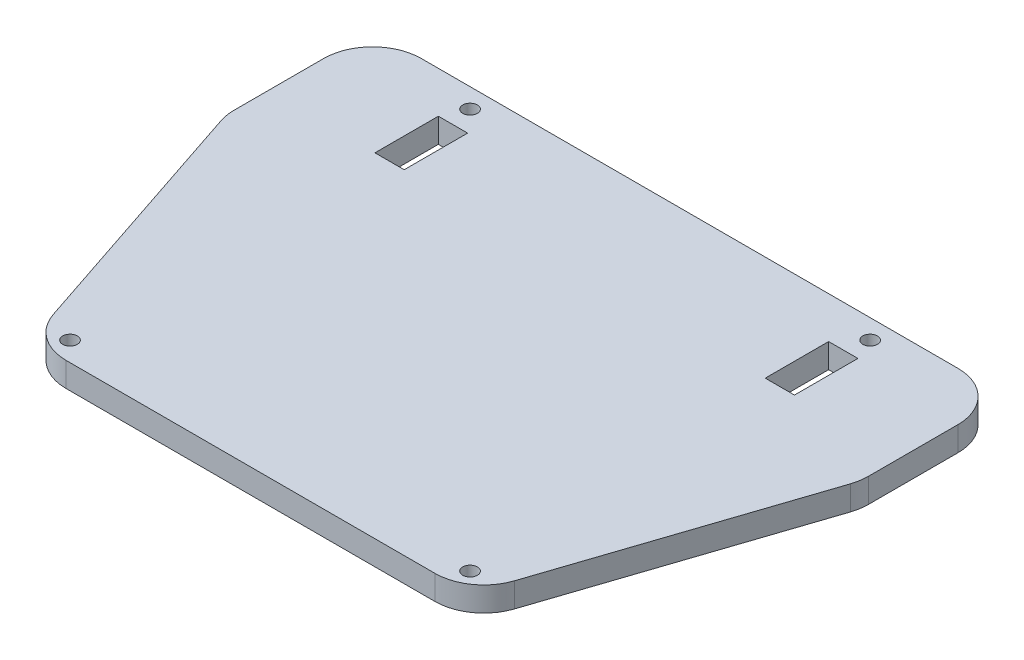
ISO-10303-21;
HEADER;
FILE_DESCRIPTION(('STEP AP214'),'2;1');
FILE_NAME('part.step','',(''),(''),'','','');
FILE_SCHEMA(('AUTOMOTIVE_DESIGN { 1 0 10303 214 1 1 1 1 }'));
ENDSEC;
DATA;
#1=APPLICATION_CONTEXT('core data for automotive mechanical design processes');
#2=APPLICATION_PROTOCOL_DEFINITION('international standard','automotive_design',2000,#1);
#3=PRODUCT_CONTEXT('',#1,'mechanical');
#4=PRODUCT('Part','Part','',(#3));
#5=PRODUCT_RELATED_PRODUCT_CATEGORY('part','',(#4));
#6=PRODUCT_DEFINITION_FORMATION('','',#4);
#7=PRODUCT_DEFINITION_CONTEXT('part definition',#1,'design');
#8=PRODUCT_DEFINITION('design','',#6,#7);
#9=PRODUCT_DEFINITION_SHAPE('','',#8);
#10=(LENGTH_UNIT() NAMED_UNIT(*) SI_UNIT(.MILLI.,.METRE.));
#11=(NAMED_UNIT(*) PLANE_ANGLE_UNIT() SI_UNIT($,.RADIAN.));
#12=(NAMED_UNIT(*) SI_UNIT($,.STERADIAN.) SOLID_ANGLE_UNIT());
#13=UNCERTAINTY_MEASURE_WITH_UNIT(LENGTH_MEASURE(1.E-05),#10,'distance_accuracy_value','');
#14=(GEOMETRIC_REPRESENTATION_CONTEXT(3) GLOBAL_UNCERTAINTY_ASSIGNED_CONTEXT((#13)) GLOBAL_UNIT_ASSIGNED_CONTEXT((#10,
#11,#12)) REPRESENTATION_CONTEXT('',''));
#15=CARTESIAN_POINT('',(0.,0.,0.));
#16=DIRECTION('',(0.,0.,1.));
#17=DIRECTION('',(1.,0.,0.));
#18=AXIS2_PLACEMENT_3D('',#15,#16,#17);
#19=CARTESIAN_POINT('',(8.,5.,0.));
#20=DIRECTION('',(-1.,0.,0.));
#21=DIRECTION('',(0.,0.,1.));
#22=AXIS2_PLACEMENT_3D('',#19,#20,#21);
#23=PLANE('',#22);
#24=DIRECTION('',(0.,0.,-1.));
#25=VECTOR('',#24,1.);
#26=CARTESIAN_POINT('',(8.,0.,0.));
#27=LINE('',#26,#25);
#28=CARTESIAN_POINT('',(8.,0.,-68.5));
#29=VERTEX_POINT('',#28);
#30=CARTESIAN_POINT('',(8.,0.,-81.5));
#31=VERTEX_POINT('',#30);
#32=EDGE_CURVE('E311',#29,#31,#27,.T.);
#33=ORIENTED_EDGE('',*,*,#32,.F.);
#34=DIRECTION('',(0.,-1.,0.));
#35=VECTOR('',#34,1.);
#36=CARTESIAN_POINT('',(8.,5.,-68.5));
#37=LINE('',#36,#35);
#38=CARTESIAN_POINT('',(8.,5.,-68.5));
#39=VERTEX_POINT('',#38);
#40=EDGE_CURVE('E345',#39,#29,#37,.T.);
#41=ORIENTED_EDGE('',*,*,#40,.F.);
#42=DIRECTION('',(0.,0.,-1.));
#43=VECTOR('',#42,1.);
#44=CARTESIAN_POINT('',(8.,5.,0.));
#45=LINE('',#44,#43);
#46=CARTESIAN_POINT('',(8.,5.,-81.5));
#47=VERTEX_POINT('',#46);
#48=EDGE_CURVE('E238',#39,#47,#45,.T.);
#49=ORIENTED_EDGE('',*,*,#48,.T.);
#50=DIRECTION('',(0.,-1.,0.));
#51=VECTOR('',#50,1.);
#52=CARTESIAN_POINT('',(8.,5.,-81.5));
#53=LINE('',#52,#51);
#54=EDGE_CURVE('E197',#47,#31,#53,.T.);
#55=ORIENTED_EDGE('',*,*,#54,.T.);
#56=EDGE_LOOP('',(#33,#41,#49,#55));
#57=FACE_BOUND('',#56,.T.);
#58=ADVANCED_FACE('F46',(#57),#23,.T.);
#59=CARTESIAN_POINT('',(0.,5.,-68.5));
#60=DIRECTION('',(0.,0.,-1.));
#61=DIRECTION('',(-1.,0.,0.));
#62=AXIS2_PLACEMENT_3D('',#59,#60,#61);
#63=PLANE('',#62);
#64=DIRECTION('',(1.,0.,0.));
#65=VECTOR('',#64,1.);
#66=CARTESIAN_POINT('',(0.,0.,-68.5));
#67=LINE('',#66,#65);
#68=CARTESIAN_POINT('',(2.,0.,-68.5));
#69=VERTEX_POINT('',#68);
#70=EDGE_CURVE('E315',#69,#29,#67,.T.);
#71=ORIENTED_EDGE('',*,*,#70,.F.);
#72=DIRECTION('',(0.,-1.,0.));
#73=VECTOR('',#72,1.);
#74=CARTESIAN_POINT('',(2.,5.,-68.5));
#75=LINE('',#74,#73);
#76=CARTESIAN_POINT('',(2.,5.,-68.5));
#77=VERTEX_POINT('',#76);
#78=EDGE_CURVE('E342',#77,#69,#75,.T.);
#79=ORIENTED_EDGE('',*,*,#78,.F.);
#80=DIRECTION('',(1.,0.,0.));
#81=VECTOR('',#80,1.);
#82=CARTESIAN_POINT('',(0.,5.,-68.5));
#83=LINE('',#82,#81);
#84=EDGE_CURVE('E243',#77,#39,#83,.T.);
#85=ORIENTED_EDGE('',*,*,#84,.T.);
#86=ORIENTED_EDGE('',*,*,#40,.T.);
#87=EDGE_LOOP('',(#71,#79,#85,#86));
#88=FACE_BOUND('',#87,.T.);
#89=ADVANCED_FACE('F511',(#88),#63,.T.);
#90=CARTESIAN_POINT('',(2.,5.,0.));
#91=DIRECTION('',(-1.,0.,0.));
#92=DIRECTION('',(0.,0.,1.));
#93=AXIS2_PLACEMENT_3D('',#90,#91,#92);
#94=PLANE('',#93);
#95=DIRECTION('',(0.,0.,-1.));
#96=VECTOR('',#95,1.);
#97=CARTESIAN_POINT('',(2.,0.,0.));
#98=LINE('',#97,#96);
#99=CARTESIAN_POINT('',(2.,0.,-81.5));
#100=VERTEX_POINT('',#99);
#101=EDGE_CURVE('E319',#69,#100,#98,.T.);
#102=ORIENTED_EDGE('',*,*,#101,.T.);
#103=DIRECTION('',(0.,-1.,0.));
#104=VECTOR('',#103,1.);
#105=CARTESIAN_POINT('',(2.,5.,-81.5));
#106=LINE('',#105,#104);
#107=CARTESIAN_POINT('',(2.,5.,-81.5));
#108=VERTEX_POINT('',#107);
#109=EDGE_CURVE('E338',#108,#100,#106,.T.);
#110=ORIENTED_EDGE('',*,*,#109,.F.);
#111=DIRECTION('',(0.,0.,-1.));
#112=VECTOR('',#111,1.);
#113=CARTESIAN_POINT('',(2.,5.,0.));
#114=LINE('',#113,#112);
#115=EDGE_CURVE('E249',#77,#108,#114,.T.);
#116=ORIENTED_EDGE('',*,*,#115,.F.);
#117=ORIENTED_EDGE('',*,*,#78,.T.);
#118=EDGE_LOOP('',(#102,#110,#116,#117));
#119=FACE_BOUND('',#118,.T.);
#120=ADVANCED_FACE('F523',(#119),#94,.F.);
#121=CARTESIAN_POINT('',(88.,5.,0.));
#122=DIRECTION('',(-1.,0.,0.));
#123=DIRECTION('',(0.,0.,1.));
#124=AXIS2_PLACEMENT_3D('',#121,#122,#123);
#125=PLANE('',#124);
#126=DIRECTION('',(0.,0.,-1.));
#127=VECTOR('',#126,1.);
#128=CARTESIAN_POINT('',(88.,0.,0.));
#129=LINE('',#128,#127);
#130=CARTESIAN_POINT('',(88.,0.,-68.5));
#131=VERTEX_POINT('',#130);
#132=CARTESIAN_POINT('',(88.,0.,-81.5));
#133=VERTEX_POINT('',#132);
#134=EDGE_CURVE('E192',#131,#133,#129,.T.);
#135=ORIENTED_EDGE('',*,*,#134,.F.);
#136=DIRECTION('',(0.,-1.,0.));
#137=VECTOR('',#136,1.);
#138=CARTESIAN_POINT('',(88.,5.,-68.5));
#139=LINE('',#138,#137);
#140=CARTESIAN_POINT('',(88.,5.,-68.5));
#141=VERTEX_POINT('',#140);
#142=EDGE_CURVE('E185',#141,#131,#139,.T.);
#143=ORIENTED_EDGE('',*,*,#142,.F.);
#144=DIRECTION('',(0.,0.,-1.));
#145=VECTOR('',#144,1.);
#146=CARTESIAN_POINT('',(88.,5.,0.));
#147=LINE('',#146,#145);
#148=CARTESIAN_POINT('',(88.,5.,-81.5));
#149=VERTEX_POINT('',#148);
#150=EDGE_CURVE('E189',#141,#149,#147,.T.);
#151=ORIENTED_EDGE('',*,*,#150,.T.);
#152=DIRECTION('',(0.,-1.,0.));
#153=VECTOR('',#152,1.);
#154=CARTESIAN_POINT('',(88.,5.,-81.5));
#155=LINE('',#154,#153);
#156=EDGE_CURVE('E265',#149,#133,#155,.T.);
#157=ORIENTED_EDGE('',*,*,#156,.T.);
#158=EDGE_LOOP('',(#135,#143,#151,#157));
#159=FACE_BOUND('',#158,.T.);
#160=ADVANCED_FACE('F187',(#159),#125,.T.);
#161=CARTESIAN_POINT('',(0.,5.,-68.5));
#162=DIRECTION('',(0.,0.,1.));
#163=DIRECTION('',(1.,0.,0.));
#164=AXIS2_PLACEMENT_3D('',#161,#162,#163);
#165=PLANE('',#164);
#166=DIRECTION('',(-1.,0.,0.));
#167=VECTOR('',#166,1.);
#168=CARTESIAN_POINT('',(0.,0.,-68.5));
#169=LINE('',#168,#167);
#170=CARTESIAN_POINT('',(82.,0.,-68.5));
#171=VERTEX_POINT('',#170);
#172=EDGE_CURVE('E300',#131,#171,#169,.T.);
#173=ORIENTED_EDGE('',*,*,#172,.T.);
#174=DIRECTION('',(0.,-1.,0.));
#175=VECTOR('',#174,1.);
#176=CARTESIAN_POINT('',(82.,5.,-68.5));
#177=LINE('',#176,#175);
#178=CARTESIAN_POINT('',(82.,5.,-68.5));
#179=VERTEX_POINT('',#178);
#180=EDGE_CURVE('E198',#179,#171,#177,.T.);
#181=ORIENTED_EDGE('',*,*,#180,.F.);
#182=DIRECTION('',(-1.,0.,0.));
#183=VECTOR('',#182,1.);
#184=CARTESIAN_POINT('',(0.,5.,-68.5));
#185=LINE('',#184,#183);
#186=EDGE_CURVE('E202',#141,#179,#185,.T.);
#187=ORIENTED_EDGE('',*,*,#186,.F.);
#188=ORIENTED_EDGE('',*,*,#142,.T.);
#189=EDGE_LOOP('',(#173,#181,#187,#188));
#190=FACE_BOUND('',#189,.T.);
#191=ADVANCED_FACE('F203',(#190),#165,.F.);
#192=CARTESIAN_POINT('',(82.,5.,0.));
#193=DIRECTION('',(-1.,0.,0.));
#194=DIRECTION('',(0.,0.,1.));
#195=AXIS2_PLACEMENT_3D('',#192,#193,#194);
#196=PLANE('',#195);
#197=DIRECTION('',(0.,0.,-1.));
#198=VECTOR('',#197,1.);
#199=CARTESIAN_POINT('',(82.,0.,0.));
#200=LINE('',#199,#198);
#201=CARTESIAN_POINT('',(82.,0.,-81.5));
#202=VERTEX_POINT('',#201);
#203=EDGE_CURVE('E303',#171,#202,#200,.T.);
#204=ORIENTED_EDGE('',*,*,#203,.T.);
#205=DIRECTION('',(0.,-1.,0.));
#206=VECTOR('',#205,1.);
#207=CARTESIAN_POINT('',(82.,5.,-81.5));
#208=LINE('',#207,#206);
#209=CARTESIAN_POINT('',(82.,5.,-81.5));
#210=VERTEX_POINT('',#209);
#211=EDGE_CURVE('E351',#210,#202,#208,.T.);
#212=ORIENTED_EDGE('',*,*,#211,.F.);
#213=DIRECTION('',(0.,0.,-1.));
#214=VECTOR('',#213,1.);
#215=CARTESIAN_POINT('',(82.,5.,0.));
#216=LINE('',#215,#214);
#217=EDGE_CURVE('E207',#179,#210,#216,.T.);
#218=ORIENTED_EDGE('',*,*,#217,.F.);
#219=ORIENTED_EDGE('',*,*,#180,.T.);
#220=EDGE_LOOP('',(#204,#212,#218,#219));
#221=FACE_BOUND('',#220,.T.);
#222=ADVANCED_FACE('F548',(#221),#196,.F.);
#223=CARTESIAN_POINT('',(-20.,5.,0.));
#224=DIRECTION('',(1.,0.,0.));
#225=DIRECTION('',(0.,0.,-1.));
#226=AXIS2_PLACEMENT_3D('',#223,#224,#225);
#227=PLANE('',#226);
#228=DIRECTION('',(0.,0.,1.));
#229=VECTOR('',#228,1.);
#230=CARTESIAN_POINT('',(-20.,0.,0.));
#231=LINE('',#230,#229);
#232=CARTESIAN_POINT('',(-20.,0.,-80.));
#233=VERTEX_POINT('',#232);
#234=CARTESIAN_POINT('',(-20.,0.,-61.6227766016838));
#235=VERTEX_POINT('',#234);
#236=EDGE_CURVE('E266',#233,#235,#231,.T.);
#237=ORIENTED_EDGE('',*,*,#236,.T.);
#238=DIRECTION('',(0.,-1.,0.));
#239=VECTOR('',#238,1.);
#240=CARTESIAN_POINT('',(-20.,5.,-61.6227766016838));
#241=LINE('',#240,#239);
#242=CARTESIAN_POINT('',(-20.,5.,-61.6227766016838));
#243=VERTEX_POINT('',#242);
#244=EDGE_CURVE('E12',#235,#243,#241,.F.);
#245=ORIENTED_EDGE('',*,*,#244,.T.);
#246=DIRECTION('',(0.,0.,1.));
#247=VECTOR('',#246,1.);
#248=CARTESIAN_POINT('',(-20.,5.,0.));
#249=LINE('',#248,#247);
#250=CARTESIAN_POINT('',(-20.,5.,-80.));
#251=VERTEX_POINT('',#250);
#252=EDGE_CURVE('E335',#251,#243,#249,.T.);
#253=ORIENTED_EDGE('',*,*,#252,.F.);
#254=DIRECTION('',(0.,-1.,0.));
#255=VECTOR('',#254,1.);
#256=CARTESIAN_POINT('',(-20.,5.,-80.));
#257=LINE('',#256,#255);
#258=EDGE_CURVE('E55',#251,#233,#257,.T.);
#259=ORIENTED_EDGE('',*,*,#258,.T.);
#260=EDGE_LOOP('',(#237,#245,#253,#259));
#261=FACE_BOUND('',#260,.T.);
#262=ADVANCED_FACE('F468',(#261),#227,.F.);
#263=CARTESIAN_POINT('',(0.,5.,0.));
#264=DIRECTION('',(0.948683298050514,0.,-0.316227766016838));
#265=DIRECTION('',(-0.316227766016838,0.,-0.948683298050514));
#266=AXIS2_PLACEMENT_3D('',#263,#264,#265);
#267=PLANE('',#266);
#268=DIRECTION('',(0.316227766016838,0.,0.948683298050514));
#269=VECTOR('',#268,1.);
#270=CARTESIAN_POINT('',(0.,0.,0.));
#271=LINE('',#270,#269);
#272=CARTESIAN_POINT('',(-19.4868329805051,0.,-58.4604989415154));
#273=VERTEX_POINT('',#272);
#274=CARTESIAN_POINT('',(-2.27924077994387,0.,-6.83772233983162));
#275=VERTEX_POINT('',#274);
#276=EDGE_CURVE('E270',#273,#275,#271,.T.);
#277=ORIENTED_EDGE('',*,*,#276,.T.);
#278=DIRECTION('',(0.,-1.,0.));
#279=VECTOR('',#278,1.);
#280=CARTESIAN_POINT('',(-2.27924077994387,5.,-6.83772233983162));
#281=LINE('',#280,#279);
#282=CARTESIAN_POINT('',(-2.27924077994387,5.,-6.83772233983162));
#283=VERTEX_POINT('',#282);
#284=EDGE_CURVE('E460',#275,#283,#281,.F.);
#285=ORIENTED_EDGE('',*,*,#284,.T.);
#286=DIRECTION('',(0.316227766016838,0.,0.948683298050514));
#287=VECTOR('',#286,1.);
#288=CARTESIAN_POINT('',(0.,5.,0.));
#289=LINE('',#288,#287);
#290=CARTESIAN_POINT('',(-19.4868329805051,5.,-58.4604989415154));
#291=VERTEX_POINT('',#290);
#292=EDGE_CURVE('E406',#291,#283,#289,.T.);
#293=ORIENTED_EDGE('',*,*,#292,.F.);
#294=DIRECTION('',(0.,-1.,0.));
#295=VECTOR('',#294,1.);
#296=CARTESIAN_POINT('',(-19.4868329805051,5.,-58.4604989415154));
#297=LINE('',#296,#295);
#298=EDGE_CURVE('E456',#291,#273,#297,.T.);
#299=ORIENTED_EDGE('',*,*,#298,.T.);
#300=EDGE_LOOP('',(#277,#285,#293,#299));
#301=FACE_BOUND('',#300,.T.);
#302=ADVANCED_FACE('F483',(#301),#267,.F.);
#303=CARTESIAN_POINT('',(0.,5.,0.));
#304=DIRECTION('',(0.,0.,-1.));
#305=DIRECTION('',(-1.,0.,0.));
#306=AXIS2_PLACEMENT_3D('',#303,#304,#305);
#307=PLANE('',#306);
#308=DIRECTION('',(1.,0.,0.));
#309=VECTOR('',#308,1.);
#310=CARTESIAN_POINT('',(0.,0.,0.));
#311=LINE('',#310,#309);
#312=CARTESIAN_POINT('',(7.20759220056126,0.,0.));
#313=VERTEX_POINT('',#312);
#314=CARTESIAN_POINT('',(82.7924077994387,0.,0.));
#315=VERTEX_POINT('',#314);
#316=EDGE_CURVE('E274',#313,#315,#311,.T.);
#317=ORIENTED_EDGE('',*,*,#316,.T.);
#318=DIRECTION('',(0.,-1.,0.));
#319=VECTOR('',#318,1.);
#320=CARTESIAN_POINT('',(82.7924077994387,5.,0.));
#321=LINE('',#320,#319);
#322=CARTESIAN_POINT('',(82.7924077994387,5.,0.));
#323=VERTEX_POINT('',#322);
#324=EDGE_CURVE('E453',#315,#323,#321,.F.);
#325=ORIENTED_EDGE('',*,*,#324,.T.);
#326=DIRECTION('',(1.,0.,0.));
#327=VECTOR('',#326,1.);
#328=CARTESIAN_POINT('',(0.,5.,0.));
#329=LINE('',#328,#327);
#330=CARTESIAN_POINT('',(7.20759220056126,5.,0.));
#331=VERTEX_POINT('',#330);
#332=EDGE_CURVE('E411',#331,#323,#329,.T.);
#333=ORIENTED_EDGE('',*,*,#332,.F.);
#334=DIRECTION('',(0.,-1.,0.));
#335=VECTOR('',#334,1.);
#336=CARTESIAN_POINT('',(7.20759220056126,5.,0.));
#337=LINE('',#336,#335);
#338=EDGE_CURVE('E449',#331,#313,#337,.T.);
#339=ORIENTED_EDGE('',*,*,#338,.T.);
#340=EDGE_LOOP('',(#317,#325,#333,#339));
#341=FACE_BOUND('',#340,.T.);
#342=ADVANCED_FACE('F494',(#341),#307,.F.);
#343=CARTESIAN_POINT('',(81.,5.,27.));
#344=DIRECTION('',(0.948683298050514,0.,0.316227766016837));
#345=DIRECTION('',(0.316227766016837,0.,-0.948683298050514));
#346=AXIS2_PLACEMENT_3D('',#343,#344,#345);
#347=PLANE('',#346);
#348=DIRECTION('',(-0.316227766016838,0.,0.948683298050514));
#349=VECTOR('',#348,1.);
#350=CARTESIAN_POINT('',(81.,0.,27.));
#351=LINE('',#350,#349);
#352=CARTESIAN_POINT('',(109.486832980505,0.,-58.4604989415155));
#353=VERTEX_POINT('',#352);
#354=CARTESIAN_POINT('',(92.2792407799439,0.,-6.83772233983163));
#355=VERTEX_POINT('',#354);
#356=EDGE_CURVE('E278',#353,#355,#351,.T.);
#357=ORIENTED_EDGE('',*,*,#356,.F.);
#358=DIRECTION('',(0.,-1.,0.));
#359=VECTOR('',#358,1.);
#360=CARTESIAN_POINT('',(109.486832980505,5.,-58.4604989415154));
#361=LINE('',#360,#359);
#362=CARTESIAN_POINT('',(109.486832980505,5.,-58.4604989415155));
#363=VERTEX_POINT('',#362);
#364=EDGE_CURVE('E69',#353,#363,#361,.F.);
#365=ORIENTED_EDGE('',*,*,#364,.T.);
#366=DIRECTION('',(-0.316227766016838,0.,0.948683298050514));
#367=VECTOR('',#366,1.);
#368=CARTESIAN_POINT('',(81.,5.,27.));
#369=LINE('',#368,#367);
#370=CARTESIAN_POINT('',(92.2792407799439,5.,-6.83772233983163));
#371=VERTEX_POINT('',#370);
#372=EDGE_CURVE('E428',#363,#371,#369,.T.);
#373=ORIENTED_EDGE('',*,*,#372,.T.);
#374=DIRECTION('',(0.,-1.,0.));
#375=VECTOR('',#374,1.);
#376=CARTESIAN_POINT('',(92.2792407799439,0.,-6.83772233983162));
#377=LINE('',#376,#375);
#378=EDGE_CURVE('E443',#371,#355,#377,.T.);
#379=ORIENTED_EDGE('',*,*,#378,.T.);
#380=EDGE_LOOP('',(#357,#365,#373,#379));
#381=FACE_BOUND('',#380,.T.);
#382=ADVANCED_FACE('F499',(#381),#347,.T.);
#383=CARTESIAN_POINT('',(110.,5.,0.));
#384=DIRECTION('',(1.,0.,0.));
#385=DIRECTION('',(0.,0.,-1.));
#386=AXIS2_PLACEMENT_3D('',#383,#384,#385);
#387=PLANE('',#386);
#388=DIRECTION('',(0.,0.,1.));
#389=VECTOR('',#388,1.);
#390=CARTESIAN_POINT('',(110.,0.,0.));
#391=LINE('',#390,#389);
#392=CARTESIAN_POINT('',(110.,0.,-80.));
#393=VERTEX_POINT('',#392);
#394=CARTESIAN_POINT('',(110.,0.,-61.6227766016838));
#395=VERTEX_POINT('',#394);
#396=EDGE_CURVE('E282',#393,#395,#391,.T.);
#397=ORIENTED_EDGE('',*,*,#396,.F.);
#398=DIRECTION('',(0.,-1.,0.));
#399=VECTOR('',#398,1.);
#400=CARTESIAN_POINT('',(110.,5.,-80.));
#401=LINE('',#400,#399);
#402=CARTESIAN_POINT('',(110.,5.,-80.));
#403=VERTEX_POINT('',#402);
#404=EDGE_CURVE('E384',#393,#403,#401,.F.);
#405=ORIENTED_EDGE('',*,*,#404,.T.);
#406=DIRECTION('',(0.,0.,1.));
#407=VECTOR('',#406,1.);
#408=CARTESIAN_POINT('',(110.,5.,0.));
#409=LINE('',#408,#407);
#410=CARTESIAN_POINT('',(110.,5.,-61.6227766016838));
#411=VERTEX_POINT('',#410);
#412=EDGE_CURVE('E432',#403,#411,#409,.T.);
#413=ORIENTED_EDGE('',*,*,#412,.T.);
#414=DIRECTION('',(0.,-1.,0.));
#415=VECTOR('',#414,1.);
#416=CARTESIAN_POINT('',(110.,5.,-61.6227766016838));
#417=LINE('',#416,#415);
#418=EDGE_CURVE('E380',#411,#395,#417,.T.);
#419=ORIENTED_EDGE('',*,*,#418,.T.);
#420=EDGE_LOOP('',(#397,#405,#413,#419));
#421=FACE_BOUND('',#420,.T.);
#422=ADVANCED_FACE('F537',(#421),#387,.T.);
#423=CARTESIAN_POINT('',(85.9999999999999,5.,-3.99999999999998));
#424=DIRECTION('',(0.,-1.,0.));
#425=DIRECTION('',(0.,0.,-1.));
#426=AXIS2_PLACEMENT_3D('',#423,#424,#425);
#427=CYLINDRICAL_SURFACE('',#426,1.5);
#428=CARTESIAN_POINT('',(85.9999999999999,5.,-3.99999999999998));
#429=DIRECTION('',(0.,1.,0.));
#430=DIRECTION('',(0.,0.,1.));
#431=AXIS2_PLACEMENT_3D('',#428,#429,#430);
#432=CIRCLE('',#431,1.5);
#433=CARTESIAN_POINT('',(85.9999999999999,5.,-2.49999999999998));
#434=VERTEX_POINT('',#433);
#435=EDGE_CURVE('E256',#434,#434,#432,.T.);
#436=ORIENTED_EDGE('',*,*,#435,.T.);
#437=EDGE_LOOP('',(#436));
#438=FACE_BOUND('',#437,.T.);
#439=CARTESIAN_POINT('',(85.9999999999999,0.,-3.99999999999998));
#440=DIRECTION('',(0.,1.,0.));
#441=DIRECTION('',(0.,0.,1.));
#442=AXIS2_PLACEMENT_3D('',#439,#440,#441);
#443=CIRCLE('',#442,1.5);
#444=CARTESIAN_POINT('',(85.9999999999999,0.,-2.49999999999998));
#445=VERTEX_POINT('',#444);
#446=EDGE_CURVE('E327',#445,#445,#443,.T.);
#447=ORIENTED_EDGE('',*,*,#446,.F.);
#448=EDGE_LOOP('',(#447));
#449=FACE_BOUND('',#448,.T.);
#450=ADVANCED_FACE('F528',(#438,#449),#427,.F.);
#451=CARTESIAN_POINT('',(0.,5.,-81.5));
#452=DIRECTION('',(0.,0.,-1.));
#453=DIRECTION('',(-1.,0.,0.));
#454=AXIS2_PLACEMENT_3D('',#451,#452,#453);
#455=PLANE('',#454);
#456=DIRECTION('',(1.,0.,0.));
#457=VECTOR('',#456,1.);
#458=CARTESIAN_POINT('',(0.,0.,-81.5));
#459=LINE('',#458,#457);
#460=EDGE_CURVE('E323',#100,#31,#459,.T.);
#461=ORIENTED_EDGE('',*,*,#460,.T.);
#462=ORIENTED_EDGE('',*,*,#54,.F.);
#463=DIRECTION('',(1.,0.,0.));
#464=VECTOR('',#463,1.);
#465=CARTESIAN_POINT('',(0.,5.,-81.5));
#466=LINE('',#465,#464);
#467=EDGE_CURVE('E253',#108,#47,#466,.T.);
#468=ORIENTED_EDGE('',*,*,#467,.F.);
#469=ORIENTED_EDGE('',*,*,#109,.T.);
#470=EDGE_LOOP('',(#461,#462,#468,#469));
#471=FACE_BOUND('',#470,.T.);
#472=ADVANCED_FACE('F525',(#471),#455,.F.);
#473=CARTESIAN_POINT('',(0.,5.,-81.5));
#474=DIRECTION('',(0.,0.,1.));
#475=DIRECTION('',(1.,0.,0.));
#476=AXIS2_PLACEMENT_3D('',#473,#474,#475);
#477=PLANE('',#476);
#478=DIRECTION('',(-1.,0.,0.));
#479=VECTOR('',#478,1.);
#480=CARTESIAN_POINT('',(0.,0.,-81.5));
#481=LINE('',#480,#479);
#482=EDGE_CURVE('E307',#133,#202,#481,.T.);
#483=ORIENTED_EDGE('',*,*,#482,.F.);
#484=ORIENTED_EDGE('',*,*,#156,.F.);
#485=DIRECTION('',(-1.,0.,0.));
#486=VECTOR('',#485,1.);
#487=CARTESIAN_POINT('',(0.,5.,-81.5));
#488=LINE('',#487,#486);
#489=EDGE_CURVE('E212',#149,#210,#488,.T.);
#490=ORIENTED_EDGE('',*,*,#489,.T.);
#491=ORIENTED_EDGE('',*,*,#211,.T.);
#492=EDGE_LOOP('',(#483,#484,#490,#491));
#493=FACE_BOUND('',#492,.T.);
#494=ADVANCED_FACE('F527',(#493),#477,.T.);
#495=CARTESIAN_POINT('',(4.,5.,-86.));
#496=DIRECTION('',(0.,-1.,0.));
#497=DIRECTION('',(0.,0.,-1.));
#498=AXIS2_PLACEMENT_3D('',#495,#496,#497);
#499=CYLINDRICAL_SURFACE('',#498,1.5);
#500=CARTESIAN_POINT('',(4.,5.,-86.));
#501=DIRECTION('',(0.,1.,0.));
#502=DIRECTION('',(0.,0.,1.));
#503=AXIS2_PLACEMENT_3D('',#500,#501,#502);
#504=CIRCLE('',#503,1.5);
#505=CARTESIAN_POINT('',(4.,5.,-84.5));
#506=VERTEX_POINT('',#505);
#507=EDGE_CURVE('E214',#506,#506,#504,.T.);
#508=ORIENTED_EDGE('',*,*,#507,.T.);
#509=EDGE_LOOP('',(#508));
#510=FACE_BOUND('',#509,.T.);
#511=CARTESIAN_POINT('',(4.,0.,-86.));
#512=DIRECTION('',(0.,1.,0.));
#513=DIRECTION('',(0.,0.,1.));
#514=AXIS2_PLACEMENT_3D('',#511,#512,#513);
#515=CIRCLE('',#514,1.5);
#516=CARTESIAN_POINT('',(4.,0.,-84.5));
#517=VERTEX_POINT('',#516);
#518=EDGE_CURVE('E294',#517,#517,#515,.T.);
#519=ORIENTED_EDGE('',*,*,#518,.F.);
#520=EDGE_LOOP('',(#519));
#521=FACE_BOUND('',#520,.T.);
#522=ADVANCED_FACE('F534',(#510,#521),#499,.F.);
#523=CARTESIAN_POINT('',(86.,5.,-86.));
#524=DIRECTION('',(0.,-1.,0.));
#525=DIRECTION('',(0.,0.,-1.));
#526=AXIS2_PLACEMENT_3D('',#523,#524,#525);
#527=CYLINDRICAL_SURFACE('',#526,1.5);
#528=CARTESIAN_POINT('',(86.,5.,-86.));
#529=DIRECTION('',(0.,1.,0.));
#530=DIRECTION('',(0.,0.,1.));
#531=AXIS2_PLACEMENT_3D('',#528,#529,#530);
#532=CIRCLE('',#531,1.5);
#533=CARTESIAN_POINT('',(86.,5.,-84.5));
#534=VERTEX_POINT('',#533);
#535=EDGE_CURVE('E218',#534,#534,#532,.F.);
#536=ORIENTED_EDGE('',*,*,#535,.F.);
#537=EDGE_LOOP('',(#536));
#538=FACE_BOUND('',#537,.T.);
#539=CARTESIAN_POINT('',(86.,0.,-86.));
#540=DIRECTION('',(0.,1.,0.));
#541=DIRECTION('',(0.,0.,1.));
#542=AXIS2_PLACEMENT_3D('',#539,#540,#541);
#543=CIRCLE('',#542,1.5);
#544=CARTESIAN_POINT('',(86.,0.,-84.5));
#545=VERTEX_POINT('',#544);
#546=EDGE_CURVE('E290',#545,#545,#543,.F.);
#547=ORIENTED_EDGE('',*,*,#546,.T.);
#548=EDGE_LOOP('',(#547));
#549=FACE_BOUND('',#548,.T.);
#550=ADVANCED_FACE('F558',(#538,#549),#527,.F.);
#551=CARTESIAN_POINT('',(0.,5.,-90.));
#552=DIRECTION('',(0.,0.,1.));
#553=DIRECTION('',(1.,0.,0.));
#554=AXIS2_PLACEMENT_3D('',#551,#552,#553);
#555=PLANE('',#554);
#556=DIRECTION('',(-1.,0.,0.));
#557=VECTOR('',#556,1.);
#558=CARTESIAN_POINT('',(0.,5.,-90.));
#559=LINE('',#558,#557);
#560=CARTESIAN_POINT('',(100.,5.,-90.));
#561=VERTEX_POINT('',#560);
#562=CARTESIAN_POINT('',(-10.,5.,-90.));
#563=VERTEX_POINT('',#562);
#564=EDGE_CURVE('E436',#561,#563,#559,.T.);
#565=ORIENTED_EDGE('',*,*,#564,.F.);
#566=DIRECTION('',(0.,-1.,0.));
#567=VECTOR('',#566,1.);
#568=CARTESIAN_POINT('',(100.,0.,-90.));
#569=LINE('',#568,#567);
#570=CARTESIAN_POINT('',(100.,0.,-90.));
#571=VERTEX_POINT('',#570);
#572=EDGE_CURVE('E358',#561,#571,#569,.T.);
#573=ORIENTED_EDGE('',*,*,#572,.T.);
#574=DIRECTION('',(-1.,0.,0.));
#575=VECTOR('',#574,1.);
#576=CARTESIAN_POINT('',(0.,0.,-90.));
#577=LINE('',#576,#575);
#578=CARTESIAN_POINT('',(-10.,0.,-90.));
#579=VERTEX_POINT('',#578);
#580=EDGE_CURVE('E286',#571,#579,#577,.T.);
#581=ORIENTED_EDGE('',*,*,#580,.T.);
#582=DIRECTION('',(0.,-1.,0.));
#583=VECTOR('',#582,1.);
#584=CARTESIAN_POINT('',(-10.,5.,-90.));
#585=LINE('',#584,#583);
#586=EDGE_CURVE('E348',#579,#563,#585,.F.);
#587=ORIENTED_EDGE('',*,*,#586,.T.);
#588=EDGE_LOOP('',(#565,#573,#581,#587));
#589=FACE_BOUND('',#588,.T.);
#590=ADVANCED_FACE('F562',(#589),#555,.F.);
#591=CARTESIAN_POINT('',(4.,5.,-3.99999999999998));
#592=DIRECTION('',(0.,-1.,0.));
#593=DIRECTION('',(0.,0.,-1.));
#594=AXIS2_PLACEMENT_3D('',#591,#592,#593);
#595=CYLINDRICAL_SURFACE('',#594,1.5);
#596=CARTESIAN_POINT('',(4.,5.,-3.99999999999998));
#597=DIRECTION('',(0.,1.,0.));
#598=DIRECTION('',(0.,0.,1.));
#599=AXIS2_PLACEMENT_3D('',#596,#597,#598);
#600=CIRCLE('',#599,1.5);
#601=CARTESIAN_POINT('',(4.,5.,-2.49999999999998));
#602=VERTEX_POINT('',#601);
#603=EDGE_CURVE('E261',#602,#602,#600,.F.);
#604=ORIENTED_EDGE('',*,*,#603,.F.);
#605=EDGE_LOOP('',(#604));
#606=FACE_BOUND('',#605,.T.);
#607=CARTESIAN_POINT('',(4.,0.,-3.99999999999998));
#608=DIRECTION('',(0.,1.,0.));
#609=DIRECTION('',(0.,0.,1.));
#610=AXIS2_PLACEMENT_3D('',#607,#608,#609);
#611=CIRCLE('',#610,1.5);
#612=CARTESIAN_POINT('',(4.,0.,-2.49999999999998));
#613=VERTEX_POINT('',#612);
#614=EDGE_CURVE('E331',#613,#613,#611,.F.);
#615=ORIENTED_EDGE('',*,*,#614,.T.);
#616=EDGE_LOOP('',(#615));
#617=FACE_BOUND('',#616,.T.);
#618=ADVANCED_FACE('F566',(#606,#617),#595,.F.);
#619=CARTESIAN_POINT('',(0.,5.,0.));
#620=DIRECTION('',(0.,1.,0.));
#621=DIRECTION('',(0.,0.,1.));
#622=AXIS2_PLACEMENT_3D('',#619,#620,#621);
#623=PLANE('',#622);
#624=ORIENTED_EDGE('',*,*,#412,.F.);
#625=CARTESIAN_POINT('',(100.,5.,-80.));
#626=DIRECTION('',(0.,1.,0.));
#627=DIRECTION('',(0.,0.,1.));
#628=AXIS2_PLACEMENT_3D('',#625,#626,#627);
#629=CIRCLE('',#628,10.);
#630=EDGE_CURVE('E439',#403,#561,#629,.T.);
#631=ORIENTED_EDGE('',*,*,#630,.T.);
#632=ORIENTED_EDGE('',*,*,#564,.T.);
#633=CARTESIAN_POINT('',(-10.,5.,-80.));
#634=DIRECTION('',(0.,1.,0.));
#635=DIRECTION('',(0.,0.,1.));
#636=AXIS2_PLACEMENT_3D('',#633,#634,#635);
#637=CIRCLE('',#636,10.);
#638=EDGE_CURVE('E387',#563,#251,#637,.T.);
#639=ORIENTED_EDGE('',*,*,#638,.T.);
#640=ORIENTED_EDGE('',*,*,#252,.T.);
#641=CARTESIAN_POINT('',(-10.,5.,-61.6227766016838));
#642=DIRECTION('',(0.,1.,0.));
#643=DIRECTION('',(0.,0.,1.));
#644=AXIS2_PLACEMENT_3D('',#641,#642,#643);
#645=CIRCLE('',#644,10.);
#646=EDGE_CURVE('E391',#243,#291,#645,.T.);
#647=ORIENTED_EDGE('',*,*,#646,.T.);
#648=ORIENTED_EDGE('',*,*,#292,.T.);
#649=CARTESIAN_POINT('',(7.20759220056126,5.,-10.));
#650=DIRECTION('',(0.,1.,0.));
#651=DIRECTION('',(0.,0.,1.));
#652=AXIS2_PLACEMENT_3D('',#649,#650,#651);
#653=CIRCLE('',#652,10.);
#654=EDGE_CURVE('E417',#283,#331,#653,.T.);
#655=ORIENTED_EDGE('',*,*,#654,.T.);
#656=ORIENTED_EDGE('',*,*,#332,.T.);
#657=CARTESIAN_POINT('',(82.7924077994387,5.,-10.));
#658=DIRECTION('',(0.,1.,0.));
#659=DIRECTION('',(0.,0.,1.));
#660=AXIS2_PLACEMENT_3D('',#657,#658,#659);
#661=CIRCLE('',#660,10.);
#662=EDGE_CURVE('E62',#323,#371,#661,.T.);
#663=ORIENTED_EDGE('',*,*,#662,.T.);
#664=ORIENTED_EDGE('',*,*,#372,.F.);
#665=CARTESIAN_POINT('',(100.,5.,-61.6227766016838));
#666=DIRECTION('',(0.,1.,0.));
#667=DIRECTION('',(0.,0.,1.));
#668=AXIS2_PLACEMENT_3D('',#665,#666,#667);
#669=CIRCLE('',#668,10.);
#670=EDGE_CURVE('E424',#363,#411,#669,.T.);
#671=ORIENTED_EDGE('',*,*,#670,.T.);
#672=EDGE_LOOP('',(#624,#631,#632,#639,#640,#647,#648,#655,#656,#663,#664,#671));
#673=FACE_BOUND('',#672,.T.);
#674=ORIENTED_EDGE('',*,*,#535,.T.);
#675=EDGE_LOOP('',(#674));
#676=FACE_BOUND('',#675,.T.);
#677=ORIENTED_EDGE('',*,*,#507,.F.);
#678=EDGE_LOOP('',(#677));
#679=FACE_BOUND('',#678,.T.);
#680=ORIENTED_EDGE('',*,*,#150,.F.);
#681=ORIENTED_EDGE('',*,*,#186,.T.);
#682=ORIENTED_EDGE('',*,*,#217,.T.);
#683=ORIENTED_EDGE('',*,*,#489,.F.);
#684=EDGE_LOOP('',(#680,#681,#682,#683));
#685=FACE_BOUND('',#684,.T.);
#686=ORIENTED_EDGE('',*,*,#48,.F.);
#687=ORIENTED_EDGE('',*,*,#84,.F.);
#688=ORIENTED_EDGE('',*,*,#115,.T.);
#689=ORIENTED_EDGE('',*,*,#467,.T.);
#690=EDGE_LOOP('',(#686,#687,#688,#689));
#691=FACE_BOUND('',#690,.T.);
#692=ORIENTED_EDGE('',*,*,#435,.F.);
#693=EDGE_LOOP('',(#692));
#694=FACE_BOUND('',#693,.T.);
#695=ORIENTED_EDGE('',*,*,#603,.T.);
#696=EDGE_LOOP('',(#695));
#697=FACE_BOUND('',#696,.T.);
#698=ADVANCED_FACE('F209',(#673,#676,#679,#685,#691,#694,#697),#623,.T.);
#699=CARTESIAN_POINT('',(0.,0.,0.));
#700=DIRECTION('',(0.,1.,0.));
#701=DIRECTION('',(0.,0.,1.));
#702=AXIS2_PLACEMENT_3D('',#699,#700,#701);
#703=PLANE('',#702);
#704=ORIENTED_EDGE('',*,*,#580,.F.);
#705=CARTESIAN_POINT('',(100.,0.,-80.));
#706=DIRECTION('',(0.,1.,0.));
#707=DIRECTION('',(0.,0.,1.));
#708=AXIS2_PLACEMENT_3D('',#705,#706,#707);
#709=CIRCLE('',#708,10.);
#710=EDGE_CURVE('E377',#571,#393,#709,.F.);
#711=ORIENTED_EDGE('',*,*,#710,.T.);
#712=ORIENTED_EDGE('',*,*,#396,.T.);
#713=CARTESIAN_POINT('',(100.,0.,-61.6227766016838));
#714=DIRECTION('',(0.,1.,0.));
#715=DIRECTION('',(0.,0.,1.));
#716=AXIS2_PLACEMENT_3D('',#713,#714,#715);
#717=CIRCLE('',#716,10.);
#718=EDGE_CURVE('E374',#395,#353,#717,.F.);
#719=ORIENTED_EDGE('',*,*,#718,.T.);
#720=ORIENTED_EDGE('',*,*,#356,.T.);
#721=CARTESIAN_POINT('',(82.7924077994387,0.,-10.));
#722=DIRECTION('',(0.,1.,0.));
#723=DIRECTION('',(0.,0.,1.));
#724=AXIS2_PLACEMENT_3D('',#721,#722,#723);
#725=CIRCLE('',#724,10.);
#726=EDGE_CURVE('E371',#355,#315,#725,.F.);
#727=ORIENTED_EDGE('',*,*,#726,.T.);
#728=ORIENTED_EDGE('',*,*,#316,.F.);
#729=CARTESIAN_POINT('',(7.20759220056126,0.,-10.));
#730=DIRECTION('',(0.,1.,0.));
#731=DIRECTION('',(0.,0.,1.));
#732=AXIS2_PLACEMENT_3D('',#729,#730,#731);
#733=CIRCLE('',#732,10.);
#734=EDGE_CURVE('E368',#313,#275,#733,.F.);
#735=ORIENTED_EDGE('',*,*,#734,.T.);
#736=ORIENTED_EDGE('',*,*,#276,.F.);
#737=CARTESIAN_POINT('',(-10.,0.,-61.6227766016838));
#738=DIRECTION('',(0.,1.,0.));
#739=DIRECTION('',(0.,0.,1.));
#740=AXIS2_PLACEMENT_3D('',#737,#738,#739);
#741=CIRCLE('',#740,10.);
#742=EDGE_CURVE('E365',#273,#235,#741,.F.);
#743=ORIENTED_EDGE('',*,*,#742,.T.);
#744=ORIENTED_EDGE('',*,*,#236,.F.);
#745=CARTESIAN_POINT('',(-10.,0.,-80.));
#746=DIRECTION('',(0.,1.,0.));
#747=DIRECTION('',(0.,0.,1.));
#748=AXIS2_PLACEMENT_3D('',#745,#746,#747);
#749=CIRCLE('',#748,10.);
#750=EDGE_CURVE('E362',#233,#579,#749,.F.);
#751=ORIENTED_EDGE('',*,*,#750,.T.);
#752=EDGE_LOOP('',(#704,#711,#712,#719,#720,#727,#728,#735,#736,#743,#744,#751));
#753=FACE_BOUND('',#752,.T.);
#754=ORIENTED_EDGE('',*,*,#546,.F.);
#755=EDGE_LOOP('',(#754));
#756=FACE_BOUND('',#755,.T.);
#757=ORIENTED_EDGE('',*,*,#518,.T.);
#758=EDGE_LOOP('',(#757));
#759=FACE_BOUND('',#758,.T.);
#760=ORIENTED_EDGE('',*,*,#134,.T.);
#761=ORIENTED_EDGE('',*,*,#482,.T.);
#762=ORIENTED_EDGE('',*,*,#203,.F.);
#763=ORIENTED_EDGE('',*,*,#172,.F.);
#764=EDGE_LOOP('',(#760,#761,#762,#763));
#765=FACE_BOUND('',#764,.T.);
#766=ORIENTED_EDGE('',*,*,#32,.T.);
#767=ORIENTED_EDGE('',*,*,#460,.F.);
#768=ORIENTED_EDGE('',*,*,#101,.F.);
#769=ORIENTED_EDGE('',*,*,#70,.T.);
#770=EDGE_LOOP('',(#766,#767,#768,#769));
#771=FACE_BOUND('',#770,.T.);
#772=ORIENTED_EDGE('',*,*,#446,.T.);
#773=EDGE_LOOP('',(#772));
#774=FACE_BOUND('',#773,.T.);
#775=ORIENTED_EDGE('',*,*,#614,.F.);
#776=EDGE_LOOP('',(#775));
#777=FACE_BOUND('',#776,.T.);
#778=ADVANCED_FACE('F474',(#753,#756,#759,#765,#771,#774,#777),#703,.F.);
#779=CARTESIAN_POINT('',(100.,5.,-80.));
#780=DIRECTION('',(0.,1.,0.));
#781=DIRECTION('',(0.,0.,1.));
#782=AXIS2_PLACEMENT_3D('',#779,#780,#781);
#783=CYLINDRICAL_SURFACE('',#782,10.);
#784=ORIENTED_EDGE('',*,*,#630,.F.);
#785=ORIENTED_EDGE('',*,*,#404,.F.);
#786=ORIENTED_EDGE('',*,*,#710,.F.);
#787=ORIENTED_EDGE('',*,*,#572,.F.);
#788=EDGE_LOOP('',(#784,#785,#786,#787));
#789=FACE_BOUND('',#788,.T.);
#790=ADVANCED_FACE('F579',(#789),#783,.T.);
#791=CARTESIAN_POINT('',(100.,5.,-61.6227766016838));
#792=DIRECTION('',(0.,-1.,0.));
#793=DIRECTION('',(0.,0.,-1.));
#794=AXIS2_PLACEMENT_3D('',#791,#792,#793);
#795=CYLINDRICAL_SURFACE('',#794,10.);
#796=ORIENTED_EDGE('',*,*,#670,.F.);
#797=ORIENTED_EDGE('',*,*,#364,.F.);
#798=ORIENTED_EDGE('',*,*,#718,.F.);
#799=ORIENTED_EDGE('',*,*,#418,.F.);
#800=EDGE_LOOP('',(#796,#797,#798,#799));
#801=FACE_BOUND('',#800,.T.);
#802=ADVANCED_FACE('F503',(#801),#795,.T.);
#803=CARTESIAN_POINT('',(82.7924077994387,5.,-10.));
#804=DIRECTION('',(0.,1.,0.));
#805=DIRECTION('',(0.,0.,1.));
#806=AXIS2_PLACEMENT_3D('',#803,#804,#805);
#807=CYLINDRICAL_SURFACE('',#806,10.);
#808=ORIENTED_EDGE('',*,*,#662,.F.);
#809=ORIENTED_EDGE('',*,*,#324,.F.);
#810=ORIENTED_EDGE('',*,*,#726,.F.);
#811=ORIENTED_EDGE('',*,*,#378,.F.);
#812=EDGE_LOOP('',(#808,#809,#810,#811));
#813=FACE_BOUND('',#812,.T.);
#814=ADVANCED_FACE('F498',(#813),#807,.T.);
#815=CARTESIAN_POINT('',(7.20759220056126,5.,-10.));
#816=DIRECTION('',(0.,-1.,0.));
#817=DIRECTION('',(0.,0.,-1.));
#818=AXIS2_PLACEMENT_3D('',#815,#816,#817);
#819=CYLINDRICAL_SURFACE('',#818,10.);
#820=ORIENTED_EDGE('',*,*,#654,.F.);
#821=ORIENTED_EDGE('',*,*,#284,.F.);
#822=ORIENTED_EDGE('',*,*,#734,.F.);
#823=ORIENTED_EDGE('',*,*,#338,.F.);
#824=EDGE_LOOP('',(#820,#821,#822,#823));
#825=FACE_BOUND('',#824,.T.);
#826=ADVANCED_FACE('F491',(#825),#819,.T.);
#827=CARTESIAN_POINT('',(-10.,5.,-61.6227766016838));
#828=DIRECTION('',(0.,-1.,0.));
#829=DIRECTION('',(0.,0.,-1.));
#830=AXIS2_PLACEMENT_3D('',#827,#828,#829);
#831=CYLINDRICAL_SURFACE('',#830,10.);
#832=ORIENTED_EDGE('',*,*,#646,.F.);
#833=ORIENTED_EDGE('',*,*,#244,.F.);
#834=ORIENTED_EDGE('',*,*,#742,.F.);
#835=ORIENTED_EDGE('',*,*,#298,.F.);
#836=EDGE_LOOP('',(#832,#833,#834,#835));
#837=FACE_BOUND('',#836,.T.);
#838=ADVANCED_FACE('F480',(#837),#831,.T.);
#839=CARTESIAN_POINT('',(-10.,5.,-80.));
#840=DIRECTION('',(0.,-1.,0.));
#841=DIRECTION('',(0.,0.,-1.));
#842=AXIS2_PLACEMENT_3D('',#839,#840,#841);
#843=CYLINDRICAL_SURFACE('',#842,10.);
#844=ORIENTED_EDGE('',*,*,#638,.F.);
#845=ORIENTED_EDGE('',*,*,#586,.F.);
#846=ORIENTED_EDGE('',*,*,#750,.F.);
#847=ORIENTED_EDGE('',*,*,#258,.F.);
#848=EDGE_LOOP('',(#844,#845,#846,#847));
#849=FACE_BOUND('',#848,.T.);
#850=ADVANCED_FACE('F48',(#849),#843,.T.);
#851=CLOSED_SHELL('',(#58,#89,#120,#160,#191,#222,#262,#302,#342,#382,#422,#450,#472,#494,#522,
#550,#590,#618,#698,#778,#790,#802,#814,#826,#838,#850));
#852=MANIFOLD_SOLID_BREP('B2',#851);
#853=ADVANCED_BREP_SHAPE_REPRESENTATION('',(#18,#852),#14);
#854=SHAPE_DEFINITION_REPRESENTATION(#9,#853);
ENDSEC;
END-ISO-10303-21;
